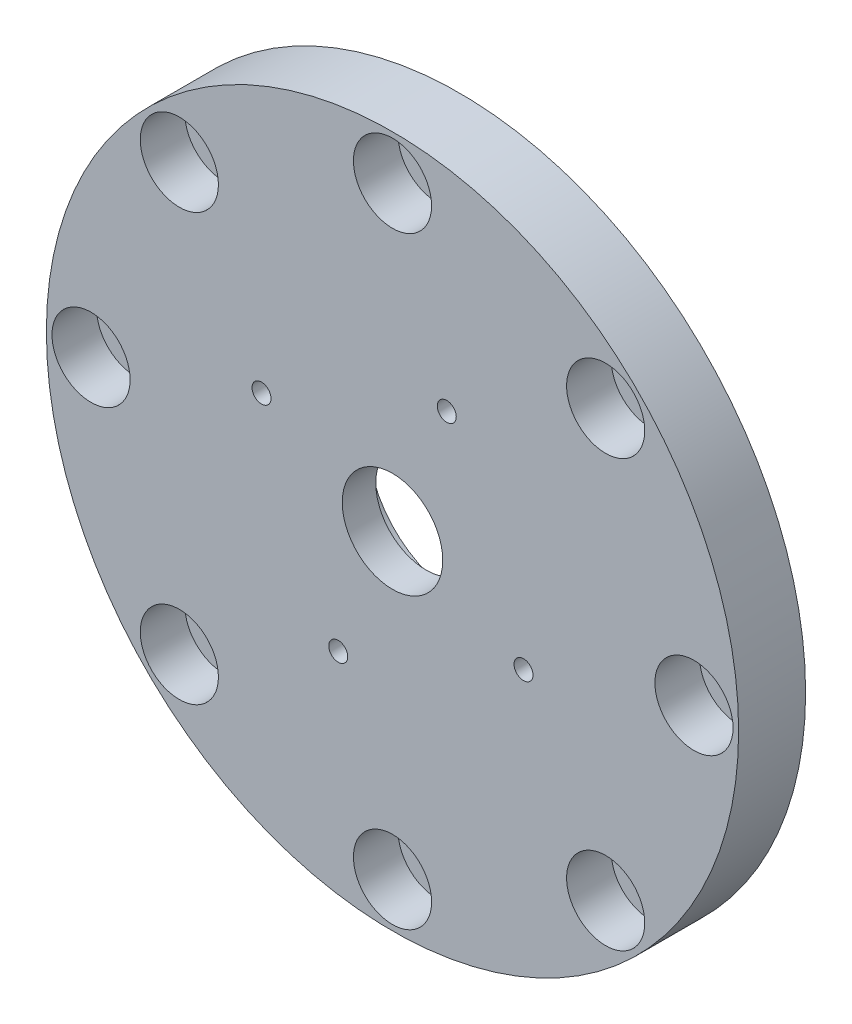
ISO-10303-21;
HEADER;
FILE_DESCRIPTION(('STEP AP214'),'2;1');
FILE_NAME('part.step','',(''),(''),'','','');
FILE_SCHEMA(('AUTOMOTIVE_DESIGN { 1 0 10303 214 1 1 1 1 }'));
ENDSEC;
DATA;
#1=APPLICATION_CONTEXT('core data for automotive mechanical design processes');
#2=APPLICATION_PROTOCOL_DEFINITION('international standard','automotive_design',2000,#1);
#3=PRODUCT_CONTEXT('',#1,'mechanical');
#4=PRODUCT('Part','Part','',(#3));
#5=PRODUCT_RELATED_PRODUCT_CATEGORY('part','',(#4));
#6=PRODUCT_DEFINITION_FORMATION('','',#4);
#7=PRODUCT_DEFINITION_CONTEXT('part definition',#1,'design');
#8=PRODUCT_DEFINITION('design','',#6,#7);
#9=PRODUCT_DEFINITION_SHAPE('','',#8);
#10=(LENGTH_UNIT() NAMED_UNIT(*) SI_UNIT(.MILLI.,.METRE.));
#11=(NAMED_UNIT(*) PLANE_ANGLE_UNIT() SI_UNIT($,.RADIAN.));
#12=(NAMED_UNIT(*) SI_UNIT($,.STERADIAN.) SOLID_ANGLE_UNIT());
#13=UNCERTAINTY_MEASURE_WITH_UNIT(LENGTH_MEASURE(1.E-05),#10,'distance_accuracy_value','');
#14=(GEOMETRIC_REPRESENTATION_CONTEXT(3) GLOBAL_UNCERTAINTY_ASSIGNED_CONTEXT((#13)) GLOBAL_UNIT_ASSIGNED_CONTEXT((#10,
#11,#12)) REPRESENTATION_CONTEXT('',''));
#15=CARTESIAN_POINT('',(0.,0.,0.));
#16=DIRECTION('',(0.,0.,1.));
#17=DIRECTION('',(1.,0.,0.));
#18=AXIS2_PLACEMENT_3D('',#15,#16,#17);
#19=CARTESIAN_POINT('',(4.86007959103561,11.733270062893,6.));
#20=DIRECTION('',(0.,0.,-1.));
#21=DIRECTION('',(-1.,0.,0.));
#22=AXIS2_PLACEMENT_3D('',#19,#20,#21);
#23=CYLINDRICAL_SURFACE('',#22,0.850000000000325);
#24=CARTESIAN_POINT('',(4.86007959103561,11.733270062893,6.));
#25=DIRECTION('',(0.,0.,1.));
#26=DIRECTION('',(1.,0.,0.));
#27=AXIS2_PLACEMENT_3D('',#24,#25,#26);
#28=CIRCLE('',#27,0.850000000000325);
#29=CARTESIAN_POINT('',(5.71007959103593,11.733270062893,6.));
#30=VERTEX_POINT('',#29);
#31=EDGE_CURVE('E52',#30,#30,#28,.T.);
#32=ORIENTED_EDGE('',*,*,#31,.T.);
#33=EDGE_LOOP('',(#32));
#34=FACE_BOUND('',#33,.T.);
#35=CARTESIAN_POINT('',(4.86007959103561,11.733270062893,2.));
#36=DIRECTION('',(0.,0.,-1.));
#37=DIRECTION('',(-1.,0.,0.));
#38=AXIS2_PLACEMENT_3D('',#35,#36,#37);
#39=CIRCLE('',#38,0.850000000000325);
#40=CARTESIAN_POINT('',(4.01007959103528,11.733270062893,2.));
#41=VERTEX_POINT('',#40);
#42=EDGE_CURVE('E41',#41,#41,#39,.T.);
#43=ORIENTED_EDGE('',*,*,#42,.T.);
#44=EDGE_LOOP('',(#43));
#45=FACE_BOUND('',#44,.T.);
#46=ADVANCED_FACE('F37',(#34,#45),#23,.F.);
#47=CARTESIAN_POINT('',(11.7332700628928,-4.86007959103533,6.));
#48=DIRECTION('',(0.,0.,-1.));
#49=DIRECTION('',(-1.,0.,0.));
#50=AXIS2_PLACEMENT_3D('',#47,#48,#49);
#51=CYLINDRICAL_SURFACE('',#50,0.850000000000424);
#52=CARTESIAN_POINT('',(11.7332700628928,-4.86007959103533,6.));
#53=DIRECTION('',(0.,0.,1.));
#54=DIRECTION('',(1.,0.,0.));
#55=AXIS2_PLACEMENT_3D('',#52,#53,#54);
#56=CIRCLE('',#55,0.850000000000424);
#57=CARTESIAN_POINT('',(12.5832700628932,-4.86007959103533,6.));
#58=VERTEX_POINT('',#57);
#59=EDGE_CURVE('E156',#58,#58,#56,.T.);
#60=ORIENTED_EDGE('',*,*,#59,.T.);
#61=EDGE_LOOP('',(#60));
#62=FACE_BOUND('',#61,.T.);
#63=CARTESIAN_POINT('',(11.7332700628928,-4.86007959103533,2.));
#64=DIRECTION('',(0.,0.,-1.));
#65=DIRECTION('',(-1.,0.,0.));
#66=AXIS2_PLACEMENT_3D('',#63,#64,#65);
#67=CIRCLE('',#66,0.850000000000424);
#68=CARTESIAN_POINT('',(10.8832700628924,-4.86007959103533,2.));
#69=VERTEX_POINT('',#68);
#70=EDGE_CURVE('E105',#69,#69,#67,.T.);
#71=ORIENTED_EDGE('',*,*,#70,.T.);
#72=EDGE_LOOP('',(#71));
#73=FACE_BOUND('',#72,.T.);
#74=ADVANCED_FACE('F305',(#62,#73),#51,.F.);
#75=CARTESIAN_POINT('',(-4.86007959103548,-11.7332700628925,6.));
#76=DIRECTION('',(0.,0.,-1.));
#77=DIRECTION('',(-1.,0.,0.));
#78=AXIS2_PLACEMENT_3D('',#75,#76,#77);
#79=CYLINDRICAL_SURFACE('',#78,0.849999999999334);
#80=CARTESIAN_POINT('',(-4.86007959103548,-11.7332700628925,6.));
#81=DIRECTION('',(0.,0.,1.));
#82=DIRECTION('',(1.,0.,0.));
#83=AXIS2_PLACEMENT_3D('',#80,#81,#82);
#84=CIRCLE('',#83,0.849999999999334);
#85=CARTESIAN_POINT('',(-4.01007959103614,-11.7332700628925,6.));
#86=VERTEX_POINT('',#85);
#87=EDGE_CURVE('E152',#86,#86,#84,.T.);
#88=ORIENTED_EDGE('',*,*,#87,.T.);
#89=EDGE_LOOP('',(#88));
#90=FACE_BOUND('',#89,.T.);
#91=CARTESIAN_POINT('',(-4.86007959103548,-11.7332700628925,2.));
#92=DIRECTION('',(0.,0.,-1.));
#93=DIRECTION('',(-1.,0.,0.));
#94=AXIS2_PLACEMENT_3D('',#91,#92,#93);
#95=CIRCLE('',#94,0.849999999999334);
#96=CARTESIAN_POINT('',(-5.71007959103481,-11.7332700628925,2.));
#97=VERTEX_POINT('',#96);
#98=EDGE_CURVE('E101',#97,#97,#95,.T.);
#99=ORIENTED_EDGE('',*,*,#98,.T.);
#100=EDGE_LOOP('',(#99));
#101=FACE_BOUND('',#100,.T.);
#102=ADVANCED_FACE('F200',(#90,#101),#79,.F.);
#103=CARTESIAN_POINT('',(-11.7332700628927,4.86007959103575,6.));
#104=DIRECTION('',(0.,0.,-1.));
#105=DIRECTION('',(-1.,0.,0.));
#106=AXIS2_PLACEMENT_3D('',#103,#104,#105);
#107=CYLINDRICAL_SURFACE('',#106,0.849999999999253);
#108=CARTESIAN_POINT('',(-11.7332700628927,4.86007959103575,6.));
#109=DIRECTION('',(0.,0.,1.));
#110=DIRECTION('',(1.,0.,0.));
#111=AXIS2_PLACEMENT_3D('',#108,#109,#110);
#112=CIRCLE('',#111,0.849999999999253);
#113=CARTESIAN_POINT('',(-10.8832700628934,4.86007959103575,6.));
#114=VERTEX_POINT('',#113);
#115=EDGE_CURVE('E148',#114,#114,#112,.T.);
#116=ORIENTED_EDGE('',*,*,#115,.T.);
#117=EDGE_LOOP('',(#116));
#118=FACE_BOUND('',#117,.T.);
#119=CARTESIAN_POINT('',(-11.7332700628927,4.86007959103575,2.));
#120=DIRECTION('',(0.,0.,-1.));
#121=DIRECTION('',(-1.,0.,0.));
#122=AXIS2_PLACEMENT_3D('',#119,#120,#121);
#123=CIRCLE('',#122,0.849999999999253);
#124=CARTESIAN_POINT('',(-12.5832700628919,4.86007959103575,2.));
#125=VERTEX_POINT('',#124);
#126=EDGE_CURVE('E97',#125,#125,#123,.T.);
#127=ORIENTED_EDGE('',*,*,#126,.T.);
#128=EDGE_LOOP('',(#127));
#129=FACE_BOUND('',#128,.T.);
#130=ADVANCED_FACE('F196',(#118,#129),#107,.F.);
#131=CARTESIAN_POINT('',(-27.,0.,6.));
#132=DIRECTION('',(0.,0.,-1.));
#133=DIRECTION('',(-1.,0.,0.));
#134=AXIS2_PLACEMENT_3D('',#131,#132,#133);
#135=CYLINDRICAL_SURFACE('',#134,1.55);
#136=CARTESIAN_POINT('',(-27.,0.,0.));
#137=DIRECTION('',(0.,0.,1.));
#138=DIRECTION('',(1.,0.,0.));
#139=AXIS2_PLACEMENT_3D('',#136,#137,#138);
#140=CIRCLE('',#139,1.55);
#141=CARTESIAN_POINT('',(-25.45,0.,0.));
#142=VERTEX_POINT('',#141);
#143=EDGE_CURVE('E172',#142,#142,#140,.T.);
#144=ORIENTED_EDGE('',*,*,#143,.F.);
#145=EDGE_LOOP('',(#144));
#146=FACE_BOUND('',#145,.T.);
#147=CARTESIAN_POINT('',(-27.,0.,2.));
#148=DIRECTION('',(0.,0.,1.));
#149=DIRECTION('',(1.,0.,0.));
#150=AXIS2_PLACEMENT_3D('',#147,#148,#149);
#151=CIRCLE('',#150,1.55);
#152=CARTESIAN_POINT('',(-25.45,0.,2.));
#153=VERTEX_POINT('',#152);
#154=EDGE_CURVE('E92',#153,#153,#151,.T.);
#155=ORIENTED_EDGE('',*,*,#154,.T.);
#156=EDGE_LOOP('',(#155));
#157=FACE_BOUND('',#156,.T.);
#158=ADVANCED_FACE('F199',(#146,#157),#135,.F.);
#159=CARTESIAN_POINT('',(-19.0918830920367,19.0918830920368,6.));
#160=DIRECTION('',(0.,0.,-1.));
#161=DIRECTION('',(-1.,0.,0.));
#162=AXIS2_PLACEMENT_3D('',#159,#160,#161);
#163=CYLINDRICAL_SURFACE('',#162,1.54999999999999);
#164=CARTESIAN_POINT('',(-19.0918830920367,19.0918830920368,0.));
#165=DIRECTION('',(0.,0.,1.));
#166=DIRECTION('',(1.,0.,0.));
#167=AXIS2_PLACEMENT_3D('',#164,#165,#166);
#168=CIRCLE('',#167,1.54999999999999);
#169=CARTESIAN_POINT('',(-17.5418830920368,19.0918830920368,0.));
#170=VERTEX_POINT('',#169);
#171=EDGE_CURVE('E168',#170,#170,#168,.T.);
#172=ORIENTED_EDGE('',*,*,#171,.F.);
#173=EDGE_LOOP('',(#172));
#174=FACE_BOUND('',#173,.T.);
#175=CARTESIAN_POINT('',(-19.0918830920367,19.0918830920368,2.));
#176=DIRECTION('',(0.,0.,1.));
#177=DIRECTION('',(1.,0.,0.));
#178=AXIS2_PLACEMENT_3D('',#175,#176,#177);
#179=CIRCLE('',#178,1.54999999999999);
#180=CARTESIAN_POINT('',(-17.5418830920368,19.0918830920368,2.));
#181=VERTEX_POINT('',#180);
#182=EDGE_CURVE('E88',#181,#181,#179,.T.);
#183=ORIENTED_EDGE('',*,*,#182,.T.);
#184=EDGE_LOOP('',(#183));
#185=FACE_BOUND('',#184,.T.);
#186=ADVANCED_FACE('F386',(#174,#185),#163,.F.);
#187=CARTESIAN_POINT('',(0.,27.,6.));
#188=DIRECTION('',(0.,0.,-1.));
#189=DIRECTION('',(-1.,0.,0.));
#190=AXIS2_PLACEMENT_3D('',#187,#188,#189);
#191=CYLINDRICAL_SURFACE('',#190,1.55);
#192=CARTESIAN_POINT('',(0.,27.,0.));
#193=DIRECTION('',(0.,0.,1.));
#194=DIRECTION('',(1.,0.,0.));
#195=AXIS2_PLACEMENT_3D('',#192,#193,#194);
#196=CIRCLE('',#195,1.55);
#197=CARTESIAN_POINT('',(1.55000000000009,27.,0.));
#198=VERTEX_POINT('',#197);
#199=EDGE_CURVE('E164',#198,#198,#196,.T.);
#200=ORIENTED_EDGE('',*,*,#199,.F.);
#201=EDGE_LOOP('',(#200));
#202=FACE_BOUND('',#201,.T.);
#203=CARTESIAN_POINT('',(0.,27.,2.));
#204=DIRECTION('',(0.,0.,1.));
#205=DIRECTION('',(1.,0.,0.));
#206=AXIS2_PLACEMENT_3D('',#203,#204,#205);
#207=CIRCLE('',#206,1.55);
#208=CARTESIAN_POINT('',(1.55000000000009,27.,2.));
#209=VERTEX_POINT('',#208);
#210=EDGE_CURVE('E84',#209,#209,#207,.T.);
#211=ORIENTED_EDGE('',*,*,#210,.T.);
#212=EDGE_LOOP('',(#211));
#213=FACE_BOUND('',#212,.T.);
#214=ADVANCED_FACE('F390',(#202,#213),#191,.F.);
#215=CARTESIAN_POINT('',(19.0918830920369,19.0918830920367,6.));
#216=DIRECTION('',(0.,0.,-1.));
#217=DIRECTION('',(-1.,0.,0.));
#218=AXIS2_PLACEMENT_3D('',#215,#216,#217);
#219=CYLINDRICAL_SURFACE('',#218,1.55);
#220=CARTESIAN_POINT('',(19.0918830920369,19.0918830920367,0.));
#221=DIRECTION('',(0.,0.,1.));
#222=DIRECTION('',(1.,0.,0.));
#223=AXIS2_PLACEMENT_3D('',#220,#221,#222);
#224=CIRCLE('',#223,1.55);
#225=CARTESIAN_POINT('',(20.6418830920369,19.0918830920367,0.));
#226=VERTEX_POINT('',#225);
#227=EDGE_CURVE('E160',#226,#226,#224,.T.);
#228=ORIENTED_EDGE('',*,*,#227,.F.);
#229=EDGE_LOOP('',(#228));
#230=FACE_BOUND('',#229,.T.);
#231=CARTESIAN_POINT('',(19.0918830920369,19.0918830920367,2.));
#232=DIRECTION('',(0.,0.,1.));
#233=DIRECTION('',(1.,0.,0.));
#234=AXIS2_PLACEMENT_3D('',#231,#232,#233);
#235=CIRCLE('',#234,1.55);
#236=CARTESIAN_POINT('',(20.6418830920369,19.0918830920367,2.));
#237=VERTEX_POINT('',#236);
#238=EDGE_CURVE('E80',#237,#237,#235,.T.);
#239=ORIENTED_EDGE('',*,*,#238,.T.);
#240=EDGE_LOOP('',(#239));
#241=FACE_BOUND('',#240,.T.);
#242=ADVANCED_FACE('F394',(#230,#241),#219,.F.);
#243=CARTESIAN_POINT('',(27.,-1.85233445939831E-13,6.));
#244=DIRECTION('',(0.,0.,-1.));
#245=DIRECTION('',(-1.,0.,0.));
#246=AXIS2_PLACEMENT_3D('',#243,#244,#245);
#247=CYLINDRICAL_SURFACE('',#246,1.55);
#248=CARTESIAN_POINT('',(27.,-1.85233445939831E-13,0.));
#249=DIRECTION('',(0.,0.,1.));
#250=DIRECTION('',(1.,0.,0.));
#251=AXIS2_PLACEMENT_3D('',#248,#249,#250);
#252=CIRCLE('',#251,1.55);
#253=CARTESIAN_POINT('',(28.55,-1.85233445939831E-13,0.));
#254=VERTEX_POINT('',#253);
#255=EDGE_CURVE('E144',#254,#254,#252,.T.);
#256=ORIENTED_EDGE('',*,*,#255,.F.);
#257=EDGE_LOOP('',(#256));
#258=FACE_BOUND('',#257,.T.);
#259=CARTESIAN_POINT('',(27.,-1.85233445939831E-13,2.));
#260=DIRECTION('',(0.,0.,1.));
#261=DIRECTION('',(1.,0.,0.));
#262=AXIS2_PLACEMENT_3D('',#259,#260,#261);
#263=CIRCLE('',#262,1.55);
#264=CARTESIAN_POINT('',(28.55,-1.85233445939831E-13,2.));
#265=VERTEX_POINT('',#264);
#266=EDGE_CURVE('E76',#265,#265,#263,.T.);
#267=ORIENTED_EDGE('',*,*,#266,.T.);
#268=EDGE_LOOP('',(#267));
#269=FACE_BOUND('',#268,.T.);
#270=ADVANCED_FACE('F397',(#258,#269),#247,.F.);
#271=CARTESIAN_POINT('',(19.0918830920366,-19.0918830920369,6.));
#272=DIRECTION('',(0.,0.,-1.));
#273=DIRECTION('',(-1.,0.,0.));
#274=AXIS2_PLACEMENT_3D('',#271,#272,#273);
#275=CYLINDRICAL_SURFACE('',#274,1.55);
#276=CARTESIAN_POINT('',(19.0918830920366,-19.0918830920369,0.));
#277=DIRECTION('',(0.,0.,1.));
#278=DIRECTION('',(1.,0.,0.));
#279=AXIS2_PLACEMENT_3D('',#276,#277,#278);
#280=CIRCLE('',#279,1.55);
#281=CARTESIAN_POINT('',(20.6418830920366,-19.0918830920369,0.));
#282=VERTEX_POINT('',#281);
#283=EDGE_CURVE('E140',#282,#282,#280,.T.);
#284=ORIENTED_EDGE('',*,*,#283,.F.);
#285=EDGE_LOOP('',(#284));
#286=FACE_BOUND('',#285,.T.);
#287=CARTESIAN_POINT('',(19.0918830920366,-19.0918830920369,2.));
#288=DIRECTION('',(0.,0.,1.));
#289=DIRECTION('',(1.,0.,0.));
#290=AXIS2_PLACEMENT_3D('',#287,#288,#289);
#291=CIRCLE('',#290,1.55);
#292=CARTESIAN_POINT('',(20.6418830920366,-19.0918830920369,2.));
#293=VERTEX_POINT('',#292);
#294=EDGE_CURVE('E72',#293,#293,#291,.T.);
#295=ORIENTED_EDGE('',*,*,#294,.T.);
#296=EDGE_LOOP('',(#295));
#297=FACE_BOUND('',#296,.T.);
#298=ADVANCED_FACE('F402',(#286,#297),#275,.F.);
#299=CARTESIAN_POINT('',(-2.79503442088596E-13,-27.,6.));
#300=DIRECTION('',(0.,0.,-1.));
#301=DIRECTION('',(-1.,0.,0.));
#302=AXIS2_PLACEMENT_3D('',#299,#300,#301);
#303=CYLINDRICAL_SURFACE('',#302,1.55);
#304=CARTESIAN_POINT('',(-2.79503442088596E-13,-27.,0.));
#305=DIRECTION('',(0.,0.,1.));
#306=DIRECTION('',(1.,0.,0.));
#307=AXIS2_PLACEMENT_3D('',#304,#305,#306);
#308=CIRCLE('',#307,1.55);
#309=CARTESIAN_POINT('',(1.54999999999972,-27.,0.));
#310=VERTEX_POINT('',#309);
#311=EDGE_CURVE('E136',#310,#310,#308,.T.);
#312=ORIENTED_EDGE('',*,*,#311,.F.);
#313=EDGE_LOOP('',(#312));
#314=FACE_BOUND('',#313,.T.);
#315=CARTESIAN_POINT('',(-2.79503442088596E-13,-27.,2.));
#316=DIRECTION('',(0.,0.,1.));
#317=DIRECTION('',(1.,0.,0.));
#318=AXIS2_PLACEMENT_3D('',#315,#316,#317);
#319=CIRCLE('',#318,1.55);
#320=CARTESIAN_POINT('',(1.54999999999972,-27.,2.));
#321=VERTEX_POINT('',#320);
#322=EDGE_CURVE('E67',#321,#321,#319,.T.);
#323=ORIENTED_EDGE('',*,*,#322,.T.);
#324=EDGE_LOOP('',(#323));
#325=FACE_BOUND('',#324,.T.);
#326=ADVANCED_FACE('F349',(#314,#325),#303,.F.);
#327=CARTESIAN_POINT('',(-19.091883092037,-19.0918830920366,6.));
#328=DIRECTION('',(0.,0.,-1.));
#329=DIRECTION('',(-1.,0.,0.));
#330=AXIS2_PLACEMENT_3D('',#327,#328,#329);
#331=CYLINDRICAL_SURFACE('',#330,1.55);
#332=CARTESIAN_POINT('',(-19.091883092037,-19.0918830920366,0.));
#333=DIRECTION('',(0.,0.,1.));
#334=DIRECTION('',(1.,0.,0.));
#335=AXIS2_PLACEMENT_3D('',#332,#333,#334);
#336=CIRCLE('',#335,1.55);
#337=CARTESIAN_POINT('',(-17.541883092037,-19.0918830920366,0.));
#338=VERTEX_POINT('',#337);
#339=EDGE_CURVE('E61',#338,#338,#336,.T.);
#340=ORIENTED_EDGE('',*,*,#339,.F.);
#341=EDGE_LOOP('',(#340));
#342=FACE_BOUND('',#341,.T.);
#343=CARTESIAN_POINT('',(-19.091883092037,-19.0918830920366,2.));
#344=DIRECTION('',(0.,0.,1.));
#345=DIRECTION('',(1.,0.,0.));
#346=AXIS2_PLACEMENT_3D('',#343,#344,#345);
#347=CIRCLE('',#346,1.55);
#348=CARTESIAN_POINT('',(-17.541883092037,-19.0918830920366,2.));
#349=VERTEX_POINT('',#348);
#350=EDGE_CURVE('E63',#349,#349,#347,.T.);
#351=ORIENTED_EDGE('',*,*,#350,.T.);
#352=EDGE_LOOP('',(#351));
#353=FACE_BOUND('',#352,.T.);
#354=ADVANCED_FACE('F346',(#342,#353),#331,.F.);
#355=CARTESIAN_POINT('',(0.,0.,6.));
#356=DIRECTION('',(0.,0.,-1.));
#357=DIRECTION('',(-1.,0.,0.));
#358=AXIS2_PLACEMENT_3D('',#355,#356,#357);
#359=CYLINDRICAL_SURFACE('',#358,4.50000000000002);
#360=CARTESIAN_POINT('',(0.,0.,6.));
#361=DIRECTION('',(0.,0.,1.));
#362=DIRECTION('',(1.,0.,0.));
#363=AXIS2_PLACEMENT_3D('',#360,#361,#362);
#364=CIRCLE('',#363,4.50000000000002);
#365=CARTESIAN_POINT('',(4.5,0.,6.));
#366=VERTEX_POINT('',#365);
#367=EDGE_CURVE('E175',#366,#366,#364,.T.);
#368=ORIENTED_EDGE('',*,*,#367,.T.);
#369=EDGE_LOOP('',(#368));
#370=FACE_BOUND('',#369,.T.);
#371=CARTESIAN_POINT('',(0.,0.,3.));
#372=DIRECTION('',(0.,0.,-1.));
#373=DIRECTION('',(-1.,0.,0.));
#374=AXIS2_PLACEMENT_3D('',#371,#372,#373);
#375=CIRCLE('',#374,4.50000000000002);
#376=CARTESIAN_POINT('',(-4.50000000000004,0.,3.));
#377=VERTEX_POINT('',#376);
#378=EDGE_CURVE('E57',#377,#377,#375,.T.);
#379=ORIENTED_EDGE('',*,*,#378,.T.);
#380=EDGE_LOOP('',(#379));
#381=FACE_BOUND('',#380,.T.);
#382=ADVANCED_FACE('F189',(#370,#381),#359,.F.);
#383=CARTESIAN_POINT('',(0.,0.,6.));
#384=DIRECTION('',(0.,0.,1.));
#385=DIRECTION('',(1.,0.,0.));
#386=AXIS2_PLACEMENT_3D('',#383,#384,#385);
#387=PLANE('',#386);
#388=CARTESIAN_POINT('',(0.,27.,6.));
#389=DIRECTION('',(0.,0.,1.));
#390=DIRECTION('',(1.,0.,0.));
#391=AXIS2_PLACEMENT_3D('',#388,#389,#390);
#392=CIRCLE('',#391,3.5);
#393=CARTESIAN_POINT('',(3.50000000000009,27.,6.));
#394=VERTEX_POINT('',#393);
#395=EDGE_CURVE('E245',#394,#394,#392,.T.);
#396=ORIENTED_EDGE('',*,*,#395,.F.);
#397=EDGE_LOOP('',(#396));
#398=FACE_BOUND('',#397,.T.);
#399=CARTESIAN_POINT('',(19.0918830920372,19.0918830920375,6.));
#400=DIRECTION('',(0.,0.,1.));
#401=DIRECTION('',(1.,0.,0.));
#402=AXIS2_PLACEMENT_3D('',#399,#400,#401);
#403=CIRCLE('',#402,3.50000000000013);
#404=CARTESIAN_POINT('',(22.5918830920373,19.0918830920375,6.));
#405=VERTEX_POINT('',#404);
#406=EDGE_CURVE('E253',#405,#405,#403,.T.);
#407=ORIENTED_EDGE('',*,*,#406,.F.);
#408=EDGE_LOOP('',(#407));
#409=FACE_BOUND('',#408,.T.);
#410=CARTESIAN_POINT('',(27.0000000000011,1.05184941624605E-12,6.));
#411=DIRECTION('',(0.,0.,1.));
#412=DIRECTION('',(1.,0.,0.));
#413=AXIS2_PLACEMENT_3D('',#410,#411,#412);
#414=CIRCLE('',#413,3.50000000000085);
#415=CARTESIAN_POINT('',(30.500000000002,1.05184941624605E-12,6.));
#416=VERTEX_POINT('',#415);
#417=EDGE_CURVE('E261',#416,#416,#414,.T.);
#418=ORIENTED_EDGE('',*,*,#417,.F.);
#419=EDGE_LOOP('',(#418));
#420=FACE_BOUND('',#419,.T.);
#421=CARTESIAN_POINT('',(19.0918830920387,-19.091883092036,6.));
#422=DIRECTION('',(0.,0.,1.));
#423=DIRECTION('',(1.,0.,0.));
#424=AXIS2_PLACEMENT_3D('',#421,#422,#423);
#425=CIRCLE('',#424,3.50000000000177);
#426=CARTESIAN_POINT('',(22.5918830920404,-19.091883092036,6.));
#427=VERTEX_POINT('',#426);
#428=EDGE_CURVE('E269',#427,#427,#425,.T.);
#429=ORIENTED_EDGE('',*,*,#428,.F.);
#430=EDGE_LOOP('',(#429));
#431=FACE_BOUND('',#430,.T.);
#432=CARTESIAN_POINT('',(2.19466228228317E-12,-27.,6.));
#433=DIRECTION('',(0.,0.,1.));
#434=DIRECTION('',(1.,0.,0.));
#435=AXIS2_PLACEMENT_3D('',#432,#433,#434);
#436=CIRCLE('',#435,3.50000000000237);
#437=CARTESIAN_POINT('',(3.50000000000456,-27.,6.));
#438=VERTEX_POINT('',#437);
#439=EDGE_CURVE('E277',#438,#438,#436,.T.);
#440=ORIENTED_EDGE('',*,*,#439,.F.);
#441=EDGE_LOOP('',(#440));
#442=FACE_BOUND('',#441,.T.);
#443=CARTESIAN_POINT('',(-19.0918830920349,-19.0918830920375,6.));
#444=DIRECTION('',(0.,0.,1.));
#445=DIRECTION('',(1.,0.,0.));
#446=AXIS2_PLACEMENT_3D('',#443,#444,#445);
#447=CIRCLE('',#446,3.50000000000232);
#448=CARTESIAN_POINT('',(-15.5918830920326,-19.0918830920375,6.));
#449=VERTEX_POINT('',#448);
#450=EDGE_CURVE('E285',#449,#449,#447,.T.);
#451=ORIENTED_EDGE('',*,*,#450,.F.);
#452=EDGE_LOOP('',(#451));
#453=FACE_BOUND('',#452,.T.);
#454=CARTESIAN_POINT('',(-26.9999999999989,-1.05515596260375E-12,6.));
#455=DIRECTION('',(0.,0.,1.));
#456=DIRECTION('',(1.,0.,0.));
#457=AXIS2_PLACEMENT_3D('',#454,#455,#456);
#458=CIRCLE('',#457,3.5000000000017);
#459=CARTESIAN_POINT('',(-23.4999999999972,-1.05515596260375E-12,6.));
#460=VERTEX_POINT('',#459);
#461=EDGE_CURVE('E123',#460,#460,#458,.T.);
#462=ORIENTED_EDGE('',*,*,#461,.F.);
#463=EDGE_LOOP('',(#462));
#464=FACE_BOUND('',#463,.T.);
#465=CARTESIAN_POINT('',(-19.0918830920364,19.091883092036,6.));
#466=DIRECTION('',(0.,0.,1.));
#467=DIRECTION('',(1.,0.,0.));
#468=AXIS2_PLACEMENT_3D('',#465,#466,#467);
#469=CIRCLE('',#468,3.50000000000088);
#470=CARTESIAN_POINT('',(-15.5918830920355,19.091883092036,6.));
#471=VERTEX_POINT('',#470);
#472=EDGE_CURVE('E112',#471,#471,#469,.T.);
#473=ORIENTED_EDGE('',*,*,#472,.F.);
#474=EDGE_LOOP('',(#473));
#475=FACE_BOUND('',#474,.T.);
#476=ORIENTED_EDGE('',*,*,#87,.F.);
#477=EDGE_LOOP('',(#476));
#478=FACE_BOUND('',#477,.T.);
#479=ORIENTED_EDGE('',*,*,#367,.F.);
#480=EDGE_LOOP('',(#479));
#481=FACE_BOUND('',#480,.T.);
#482=CARTESIAN_POINT('',(0.,0.,6.));
#483=DIRECTION('',(0.,0.,1.));
#484=DIRECTION('',(1.,0.,0.));
#485=AXIS2_PLACEMENT_3D('',#482,#483,#484);
#486=CIRCLE('',#485,31.);
#487=CARTESIAN_POINT('',(31.,0.,6.));
#488=VERTEX_POINT('',#487);
#489=EDGE_CURVE('E10',#488,#488,#486,.T.);
#490=ORIENTED_EDGE('',*,*,#489,.T.);
#491=EDGE_LOOP('',(#490));
#492=FACE_BOUND('',#491,.T.);
#493=ORIENTED_EDGE('',*,*,#31,.F.);
#494=EDGE_LOOP('',(#493));
#495=FACE_BOUND('',#494,.T.);
#496=ORIENTED_EDGE('',*,*,#59,.F.);
#497=EDGE_LOOP('',(#496));
#498=FACE_BOUND('',#497,.T.);
#499=ORIENTED_EDGE('',*,*,#115,.F.);
#500=EDGE_LOOP('',(#499));
#501=FACE_BOUND('',#500,.T.);
#502=ADVANCED_FACE('F185',(#398,#409,#420,#431,#442,#453,#464,#475,#478,#481,#492,#495,#498,
#501),#387,.T.);
#503=CARTESIAN_POINT('',(0.,0.,0.));
#504=DIRECTION('',(0.,0.,1.));
#505=DIRECTION('',(1.,0.,0.));
#506=AXIS2_PLACEMENT_3D('',#503,#504,#505);
#507=PLANE('',#506);
#508=CARTESIAN_POINT('',(4.86007959103561,11.733270062893,0.));
#509=DIRECTION('',(0.,0.,-1.));
#510=DIRECTION('',(-1.,0.,0.));
#511=AXIS2_PLACEMENT_3D('',#508,#509,#510);
#512=CIRCLE('',#511,2.2);
#513=CARTESIAN_POINT('',(2.66007959103561,11.733270062893,0.));
#514=VERTEX_POINT('',#513);
#515=EDGE_CURVE('E215',#514,#514,#512,.T.);
#516=ORIENTED_EDGE('',*,*,#515,.F.);
#517=EDGE_LOOP('',(#516));
#518=FACE_BOUND('',#517,.T.);
#519=CARTESIAN_POINT('',(-11.7332700628929,4.86007959103561,0.));
#520=DIRECTION('',(0.,0.,-1.));
#521=DIRECTION('',(-1.,0.,0.));
#522=AXIS2_PLACEMENT_3D('',#519,#520,#521);
#523=CIRCLE('',#522,2.2);
#524=CARTESIAN_POINT('',(-13.9332700628929,4.86007959103561,0.));
#525=VERTEX_POINT('',#524);
#526=EDGE_CURVE('E216',#525,#525,#523,.T.);
#527=ORIENTED_EDGE('',*,*,#526,.F.);
#528=EDGE_LOOP('',(#527));
#529=FACE_BOUND('',#528,.T.);
#530=CARTESIAN_POINT('',(-4.86007959103561,-11.733270062893,0.));
#531=DIRECTION('',(0.,0.,-1.));
#532=DIRECTION('',(-1.,0.,0.));
#533=AXIS2_PLACEMENT_3D('',#530,#531,#532);
#534=CIRCLE('',#533,2.2);
#535=CARTESIAN_POINT('',(-7.06007959103561,-11.733270062893,0.));
#536=VERTEX_POINT('',#535);
#537=EDGE_CURVE('E230',#536,#536,#534,.T.);
#538=ORIENTED_EDGE('',*,*,#537,.F.);
#539=EDGE_LOOP('',(#538));
#540=FACE_BOUND('',#539,.T.);
#541=CARTESIAN_POINT('',(11.7332700628929,-4.86007959103561,0.));
#542=DIRECTION('',(0.,0.,-1.));
#543=DIRECTION('',(-1.,0.,0.));
#544=AXIS2_PLACEMENT_3D('',#541,#542,#543);
#545=CIRCLE('',#544,2.2);
#546=CARTESIAN_POINT('',(9.53327006289295,-4.86007959103561,0.));
#547=VERTEX_POINT('',#546);
#548=EDGE_CURVE('E238',#547,#547,#545,.T.);
#549=ORIENTED_EDGE('',*,*,#548,.F.);
#550=EDGE_LOOP('',(#549));
#551=FACE_BOUND('',#550,.T.);
#552=CARTESIAN_POINT('',(0.,0.,0.));
#553=DIRECTION('',(0.,0.,-1.));
#554=DIRECTION('',(-1.,0.,0.));
#555=AXIS2_PLACEMENT_3D('',#552,#553,#554);
#556=CIRCLE('',#555,8.2);
#557=CARTESIAN_POINT('',(-8.2,0.,0.));
#558=VERTEX_POINT('',#557);
#559=EDGE_CURVE('E96',#558,#558,#556,.T.);
#560=ORIENTED_EDGE('',*,*,#559,.F.);
#561=EDGE_LOOP('',(#560));
#562=FACE_BOUND('',#561,.T.);
#563=CARTESIAN_POINT('',(0.,0.,0.));
#564=DIRECTION('',(0.,0.,1.));
#565=DIRECTION('',(1.,0.,0.));
#566=AXIS2_PLACEMENT_3D('',#563,#564,#565);
#567=CIRCLE('',#566,31.);
#568=CARTESIAN_POINT('',(31.,0.,0.));
#569=VERTEX_POINT('',#568);
#570=EDGE_CURVE('E46',#569,#569,#567,.T.);
#571=ORIENTED_EDGE('',*,*,#570,.F.);
#572=EDGE_LOOP('',(#571));
#573=FACE_BOUND('',#572,.T.);
#574=ORIENTED_EDGE('',*,*,#143,.T.);
#575=EDGE_LOOP('',(#574));
#576=FACE_BOUND('',#575,.T.);
#577=ORIENTED_EDGE('',*,*,#171,.T.);
#578=EDGE_LOOP('',(#577));
#579=FACE_BOUND('',#578,.T.);
#580=ORIENTED_EDGE('',*,*,#199,.T.);
#581=EDGE_LOOP('',(#580));
#582=FACE_BOUND('',#581,.T.);
#583=ORIENTED_EDGE('',*,*,#227,.T.);
#584=EDGE_LOOP('',(#583));
#585=FACE_BOUND('',#584,.T.);
#586=ORIENTED_EDGE('',*,*,#255,.T.);
#587=EDGE_LOOP('',(#586));
#588=FACE_BOUND('',#587,.T.);
#589=ORIENTED_EDGE('',*,*,#283,.T.);
#590=EDGE_LOOP('',(#589));
#591=FACE_BOUND('',#590,.T.);
#592=ORIENTED_EDGE('',*,*,#311,.T.);
#593=EDGE_LOOP('',(#592));
#594=FACE_BOUND('',#593,.T.);
#595=ORIENTED_EDGE('',*,*,#339,.T.);
#596=EDGE_LOOP('',(#595));
#597=FACE_BOUND('',#596,.T.);
#598=ADVANCED_FACE('F188',(#518,#529,#540,#551,#562,#573,#576,#579,#582,#585,#588,#591,#594,
#597),#507,.F.);
#599=CARTESIAN_POINT('',(0.,0.,6.));
#600=DIRECTION('',(0.,0.,-1.));
#601=DIRECTION('',(-1.,0.,0.));
#602=AXIS2_PLACEMENT_3D('',#599,#600,#601);
#603=CYLINDRICAL_SURFACE('',#602,31.);
#604=ORIENTED_EDGE('',*,*,#489,.F.);
#605=EDGE_LOOP('',(#604));
#606=FACE_BOUND('',#605,.T.);
#607=ORIENTED_EDGE('',*,*,#570,.T.);
#608=EDGE_LOOP('',(#607));
#609=FACE_BOUND('',#608,.T.);
#610=ADVANCED_FACE('F39',(#606,#609),#603,.T.);
#611=CARTESIAN_POINT('',(0.,0.,3.));
#612=DIRECTION('',(0.,0.,-1.));
#613=DIRECTION('',(-1.,0.,0.));
#614=AXIS2_PLACEMENT_3D('',#611,#612,#613);
#615=CYLINDRICAL_SURFACE('',#614,8.2);
#616=CARTESIAN_POINT('',(0.,0.,3.));
#617=DIRECTION('',(0.,0.,-1.));
#618=DIRECTION('',(-1.,0.,0.));
#619=AXIS2_PLACEMENT_3D('',#616,#617,#618);
#620=CIRCLE('',#619,8.2);
#621=CARTESIAN_POINT('',(-8.2,0.,3.));
#622=VERTEX_POINT('',#621);
#623=EDGE_CURVE('E62',#622,#622,#620,.T.);
#624=ORIENTED_EDGE('',*,*,#623,.F.);
#625=EDGE_LOOP('',(#624));
#626=FACE_BOUND('',#625,.T.);
#627=ORIENTED_EDGE('',*,*,#559,.T.);
#628=EDGE_LOOP('',(#627));
#629=FACE_BOUND('',#628,.T.);
#630=ADVANCED_FACE('F370',(#626,#629),#615,.F.);
#631=CARTESIAN_POINT('',(0.,0.,3.));
#632=DIRECTION('',(0.,0.,-1.));
#633=DIRECTION('',(-1.,0.,0.));
#634=AXIS2_PLACEMENT_3D('',#631,#632,#633);
#635=PLANE('',#634);
#636=ORIENTED_EDGE('',*,*,#378,.F.);
#637=EDGE_LOOP('',(#636));
#638=FACE_BOUND('',#637,.T.);
#639=ORIENTED_EDGE('',*,*,#623,.T.);
#640=EDGE_LOOP('',(#639));
#641=FACE_BOUND('',#640,.T.);
#642=ADVANCED_FACE('F363',(#638,#641),#635,.T.);
#643=CARTESIAN_POINT('',(-19.0918830920349,-19.0918830920375,2.));
#644=DIRECTION('',(0.,0.,1.));
#645=DIRECTION('',(1.,0.,0.));
#646=AXIS2_PLACEMENT_3D('',#643,#644,#645);
#647=CYLINDRICAL_SURFACE('',#646,3.50000000000232);
#648=CARTESIAN_POINT('',(-19.0918830920349,-19.0918830920375,2.));
#649=DIRECTION('',(0.,0.,1.));
#650=DIRECTION('',(1.,0.,0.));
#651=AXIS2_PLACEMENT_3D('',#648,#649,#650);
#652=CIRCLE('',#651,3.50000000000232);
#653=CARTESIAN_POINT('',(-15.5918830920326,-19.0918830920375,2.));
#654=VERTEX_POINT('',#653);
#655=EDGE_CURVE('E281',#654,#654,#652,.T.);
#656=ORIENTED_EDGE('',*,*,#655,.F.);
#657=EDGE_LOOP('',(#656));
#658=FACE_BOUND('',#657,.T.);
#659=ORIENTED_EDGE('',*,*,#450,.T.);
#660=EDGE_LOOP('',(#659));
#661=FACE_BOUND('',#660,.T.);
#662=ADVANCED_FACE('F357',(#658,#661),#647,.F.);
#663=CARTESIAN_POINT('',(-19.0918830920349,-19.0918830920375,2.));
#664=DIRECTION('',(0.,0.,1.));
#665=DIRECTION('',(1.,0.,0.));
#666=AXIS2_PLACEMENT_3D('',#663,#664,#665);
#667=PLANE('',#666);
#668=ORIENTED_EDGE('',*,*,#350,.F.);
#669=EDGE_LOOP('',(#668));
#670=FACE_BOUND('',#669,.T.);
#671=ORIENTED_EDGE('',*,*,#655,.T.);
#672=EDGE_LOOP('',(#671));
#673=FACE_BOUND('',#672,.T.);
#674=ADVANCED_FACE('F353',(#670,#673),#667,.T.);
#675=CARTESIAN_POINT('',(2.19466228228317E-12,-27.,2.));
#676=DIRECTION('',(0.,0.,1.));
#677=DIRECTION('',(1.,0.,0.));
#678=AXIS2_PLACEMENT_3D('',#675,#676,#677);
#679=CYLINDRICAL_SURFACE('',#678,3.50000000000237);
#680=CARTESIAN_POINT('',(2.19466228228317E-12,-27.,2.));
#681=DIRECTION('',(0.,0.,1.));
#682=DIRECTION('',(1.,0.,0.));
#683=AXIS2_PLACEMENT_3D('',#680,#681,#682);
#684=CIRCLE('',#683,3.50000000000237);
#685=CARTESIAN_POINT('',(3.50000000000456,-27.,2.));
#686=VERTEX_POINT('',#685);
#687=EDGE_CURVE('E273',#686,#686,#684,.T.);
#688=ORIENTED_EDGE('',*,*,#687,.F.);
#689=EDGE_LOOP('',(#688));
#690=FACE_BOUND('',#689,.T.);
#691=ORIENTED_EDGE('',*,*,#439,.T.);
#692=EDGE_LOOP('',(#691));
#693=FACE_BOUND('',#692,.T.);
#694=ADVANCED_FACE('F356',(#690,#693),#679,.F.);
#695=CARTESIAN_POINT('',(2.19466228228317E-12,-27.,2.));
#696=DIRECTION('',(0.,0.,1.));
#697=DIRECTION('',(1.,0.,0.));
#698=AXIS2_PLACEMENT_3D('',#695,#696,#697);
#699=PLANE('',#698);
#700=ORIENTED_EDGE('',*,*,#322,.F.);
#701=EDGE_LOOP('',(#700));
#702=FACE_BOUND('',#701,.T.);
#703=ORIENTED_EDGE('',*,*,#687,.T.);
#704=EDGE_LOOP('',(#703));
#705=FACE_BOUND('',#704,.T.);
#706=ADVANCED_FACE('F478',(#702,#705),#699,.T.);
#707=CARTESIAN_POINT('',(19.0918830920387,-19.091883092036,2.));
#708=DIRECTION('',(0.,0.,1.));
#709=DIRECTION('',(1.,0.,0.));
#710=AXIS2_PLACEMENT_3D('',#707,#708,#709);
#711=CYLINDRICAL_SURFACE('',#710,3.50000000000177);
#712=CARTESIAN_POINT('',(19.0918830920387,-19.091883092036,2.));
#713=DIRECTION('',(0.,0.,1.));
#714=DIRECTION('',(1.,0.,0.));
#715=AXIS2_PLACEMENT_3D('',#712,#713,#714);
#716=CIRCLE('',#715,3.50000000000177);
#717=CARTESIAN_POINT('',(22.5918830920404,-19.091883092036,2.));
#718=VERTEX_POINT('',#717);
#719=EDGE_CURVE('E265',#718,#718,#716,.T.);
#720=ORIENTED_EDGE('',*,*,#719,.F.);
#721=EDGE_LOOP('',(#720));
#722=FACE_BOUND('',#721,.T.);
#723=ORIENTED_EDGE('',*,*,#428,.T.);
#724=EDGE_LOOP('',(#723));
#725=FACE_BOUND('',#724,.T.);
#726=ADVANCED_FACE('F474',(#722,#725),#711,.F.);
#727=CARTESIAN_POINT('',(19.0918830920387,-19.091883092036,2.));
#728=DIRECTION('',(0.,0.,1.));
#729=DIRECTION('',(1.,0.,0.));
#730=AXIS2_PLACEMENT_3D('',#727,#728,#729);
#731=PLANE('',#730);
#732=ORIENTED_EDGE('',*,*,#294,.F.);
#733=EDGE_LOOP('',(#732));
#734=FACE_BOUND('',#733,.T.);
#735=ORIENTED_EDGE('',*,*,#719,.T.);
#736=EDGE_LOOP('',(#735));
#737=FACE_BOUND('',#736,.T.);
#738=ADVANCED_FACE('F470',(#734,#737),#731,.T.);
#739=CARTESIAN_POINT('',(27.0000000000011,1.05184941624605E-12,2.));
#740=DIRECTION('',(0.,0.,1.));
#741=DIRECTION('',(1.,0.,0.));
#742=AXIS2_PLACEMENT_3D('',#739,#740,#741);
#743=CYLINDRICAL_SURFACE('',#742,3.50000000000085);
#744=CARTESIAN_POINT('',(27.0000000000011,1.05184941624605E-12,2.));
#745=DIRECTION('',(0.,0.,1.));
#746=DIRECTION('',(1.,0.,0.));
#747=AXIS2_PLACEMENT_3D('',#744,#745,#746);
#748=CIRCLE('',#747,3.50000000000085);
#749=CARTESIAN_POINT('',(30.500000000002,1.05184941624605E-12,2.));
#750=VERTEX_POINT('',#749);
#751=EDGE_CURVE('E257',#750,#750,#748,.T.);
#752=ORIENTED_EDGE('',*,*,#751,.F.);
#753=EDGE_LOOP('',(#752));
#754=FACE_BOUND('',#753,.T.);
#755=ORIENTED_EDGE('',*,*,#417,.T.);
#756=EDGE_LOOP('',(#755));
#757=FACE_BOUND('',#756,.T.);
#758=ADVANCED_FACE('F466',(#754,#757),#743,.F.);
#759=CARTESIAN_POINT('',(27.0000000000011,1.05184941624605E-12,2.));
#760=DIRECTION('',(0.,0.,1.));
#761=DIRECTION('',(1.,0.,0.));
#762=AXIS2_PLACEMENT_3D('',#759,#760,#761);
#763=PLANE('',#762);
#764=ORIENTED_EDGE('',*,*,#266,.F.);
#765=EDGE_LOOP('',(#764));
#766=FACE_BOUND('',#765,.T.);
#767=ORIENTED_EDGE('',*,*,#751,.T.);
#768=EDGE_LOOP('',(#767));
#769=FACE_BOUND('',#768,.T.);
#770=ADVANCED_FACE('F462',(#766,#769),#763,.T.);
#771=CARTESIAN_POINT('',(19.0918830920372,19.0918830920375,2.));
#772=DIRECTION('',(0.,0.,1.));
#773=DIRECTION('',(1.,0.,0.));
#774=AXIS2_PLACEMENT_3D('',#771,#772,#773);
#775=CYLINDRICAL_SURFACE('',#774,3.50000000000013);
#776=CARTESIAN_POINT('',(19.0918830920372,19.0918830920375,2.));
#777=DIRECTION('',(0.,0.,1.));
#778=DIRECTION('',(1.,0.,0.));
#779=AXIS2_PLACEMENT_3D('',#776,#777,#778);
#780=CIRCLE('',#779,3.50000000000013);
#781=CARTESIAN_POINT('',(22.5918830920373,19.0918830920375,2.));
#782=VERTEX_POINT('',#781);
#783=EDGE_CURVE('E249',#782,#782,#780,.T.);
#784=ORIENTED_EDGE('',*,*,#783,.F.);
#785=EDGE_LOOP('',(#784));
#786=FACE_BOUND('',#785,.T.);
#787=ORIENTED_EDGE('',*,*,#406,.T.);
#788=EDGE_LOOP('',(#787));
#789=FACE_BOUND('',#788,.T.);
#790=ADVANCED_FACE('F458',(#786,#789),#775,.F.);
#791=CARTESIAN_POINT('',(19.0918830920372,19.0918830920375,2.));
#792=DIRECTION('',(0.,0.,1.));
#793=DIRECTION('',(1.,0.,0.));
#794=AXIS2_PLACEMENT_3D('',#791,#792,#793);
#795=PLANE('',#794);
#796=ORIENTED_EDGE('',*,*,#238,.F.);
#797=EDGE_LOOP('',(#796));
#798=FACE_BOUND('',#797,.T.);
#799=ORIENTED_EDGE('',*,*,#783,.T.);
#800=EDGE_LOOP('',(#799));
#801=FACE_BOUND('',#800,.T.);
#802=ADVANCED_FACE('F454',(#798,#801),#795,.T.);
#803=CARTESIAN_POINT('',(0.,27.,2.));
#804=DIRECTION('',(0.,0.,1.));
#805=DIRECTION('',(1.,0.,0.));
#806=AXIS2_PLACEMENT_3D('',#803,#804,#805);
#807=CYLINDRICAL_SURFACE('',#806,3.5);
#808=CARTESIAN_POINT('',(0.,27.,2.));
#809=DIRECTION('',(0.,0.,1.));
#810=DIRECTION('',(1.,0.,0.));
#811=AXIS2_PLACEMENT_3D('',#808,#809,#810);
#812=CIRCLE('',#811,3.5);
#813=CARTESIAN_POINT('',(3.50000000000009,27.,2.));
#814=VERTEX_POINT('',#813);
#815=EDGE_CURVE('E68',#814,#814,#812,.T.);
#816=ORIENTED_EDGE('',*,*,#815,.F.);
#817=EDGE_LOOP('',(#816));
#818=FACE_BOUND('',#817,.T.);
#819=ORIENTED_EDGE('',*,*,#395,.T.);
#820=EDGE_LOOP('',(#819));
#821=FACE_BOUND('',#820,.T.);
#822=ADVANCED_FACE('F450',(#818,#821),#807,.F.);
#823=CARTESIAN_POINT('',(0.,27.,2.));
#824=DIRECTION('',(0.,0.,1.));
#825=DIRECTION('',(1.,0.,0.));
#826=AXIS2_PLACEMENT_3D('',#823,#824,#825);
#827=PLANE('',#826);
#828=ORIENTED_EDGE('',*,*,#210,.F.);
#829=EDGE_LOOP('',(#828));
#830=FACE_BOUND('',#829,.T.);
#831=ORIENTED_EDGE('',*,*,#815,.T.);
#832=EDGE_LOOP('',(#831));
#833=FACE_BOUND('',#832,.T.);
#834=ADVANCED_FACE('F417',(#830,#833),#827,.T.);
#835=CARTESIAN_POINT('',(-19.0918830920364,19.091883092036,2.));
#836=DIRECTION('',(0.,0.,1.));
#837=DIRECTION('',(1.,0.,0.));
#838=AXIS2_PLACEMENT_3D('',#835,#836,#837);
#839=CYLINDRICAL_SURFACE('',#838,3.50000000000088);
#840=CARTESIAN_POINT('',(-19.0918830920364,19.091883092036,2.));
#841=DIRECTION('',(0.,0.,1.));
#842=DIRECTION('',(1.,0.,0.));
#843=AXIS2_PLACEMENT_3D('',#840,#841,#842);
#844=CIRCLE('',#843,3.50000000000088);
#845=CARTESIAN_POINT('',(-15.5918830920355,19.091883092036,2.));
#846=VERTEX_POINT('',#845);
#847=EDGE_CURVE('E117',#846,#846,#844,.T.);
#848=ORIENTED_EDGE('',*,*,#847,.F.);
#849=EDGE_LOOP('',(#848));
#850=FACE_BOUND('',#849,.T.);
#851=ORIENTED_EDGE('',*,*,#472,.T.);
#852=EDGE_LOOP('',(#851));
#853=FACE_BOUND('',#852,.T.);
#854=ADVANCED_FACE('F413',(#850,#853),#839,.F.);
#855=CARTESIAN_POINT('',(-19.0918830920364,19.091883092036,2.));
#856=DIRECTION('',(0.,0.,1.));
#857=DIRECTION('',(1.,0.,0.));
#858=AXIS2_PLACEMENT_3D('',#855,#856,#857);
#859=PLANE('',#858);
#860=ORIENTED_EDGE('',*,*,#182,.F.);
#861=EDGE_LOOP('',(#860));
#862=FACE_BOUND('',#861,.T.);
#863=ORIENTED_EDGE('',*,*,#847,.T.);
#864=EDGE_LOOP('',(#863));
#865=FACE_BOUND('',#864,.T.);
#866=ADVANCED_FACE('F416',(#862,#865),#859,.T.);
#867=CARTESIAN_POINT('',(-26.9999999999989,-1.05515596260375E-12,2.));
#868=DIRECTION('',(0.,0.,1.));
#869=DIRECTION('',(1.,0.,0.));
#870=AXIS2_PLACEMENT_3D('',#867,#868,#869);
#871=CYLINDRICAL_SURFACE('',#870,3.5000000000017);
#872=CARTESIAN_POINT('',(-26.9999999999989,-1.05515596260375E-12,2.));
#873=DIRECTION('',(0.,0.,1.));
#874=DIRECTION('',(1.,0.,0.));
#875=AXIS2_PLACEMENT_3D('',#872,#873,#874);
#876=CIRCLE('',#875,3.5000000000017);
#877=CARTESIAN_POINT('',(-23.4999999999972,-1.05515596260375E-12,2.));
#878=VERTEX_POINT('',#877);
#879=EDGE_CURVE('E289',#878,#878,#876,.T.);
#880=ORIENTED_EDGE('',*,*,#879,.F.);
#881=EDGE_LOOP('',(#880));
#882=FACE_BOUND('',#881,.T.);
#883=ORIENTED_EDGE('',*,*,#461,.T.);
#884=EDGE_LOOP('',(#883));
#885=FACE_BOUND('',#884,.T.);
#886=ADVANCED_FACE('F296',(#882,#885),#871,.F.);
#887=CARTESIAN_POINT('',(-26.9999999999989,-1.05515596260375E-12,2.));
#888=DIRECTION('',(0.,0.,1.));
#889=DIRECTION('',(1.,0.,0.));
#890=AXIS2_PLACEMENT_3D('',#887,#888,#889);
#891=PLANE('',#890);
#892=ORIENTED_EDGE('',*,*,#154,.F.);
#893=EDGE_LOOP('',(#892));
#894=FACE_BOUND('',#893,.T.);
#895=ORIENTED_EDGE('',*,*,#879,.T.);
#896=EDGE_LOOP('',(#895));
#897=FACE_BOUND('',#896,.T.);
#898=ADVANCED_FACE('F423',(#894,#897),#891,.T.);
#899=CARTESIAN_POINT('',(-11.7332700628929,4.86007959103561,2.));
#900=DIRECTION('',(0.,0.,-1.));
#901=DIRECTION('',(-1.,0.,0.));
#902=AXIS2_PLACEMENT_3D('',#899,#900,#901);
#903=CYLINDRICAL_SURFACE('',#902,2.2);
#904=CARTESIAN_POINT('',(-11.7332700628929,4.86007959103561,2.));
#905=DIRECTION('',(0.,0.,-1.));
#906=DIRECTION('',(-1.,0.,0.));
#907=AXIS2_PLACEMENT_3D('',#904,#905,#906);
#908=CIRCLE('',#907,2.2);
#909=CARTESIAN_POINT('',(-13.9332700628929,4.86007959103561,2.));
#910=VERTEX_POINT('',#909);
#911=EDGE_CURVE('E212',#910,#910,#908,.T.);
#912=ORIENTED_EDGE('',*,*,#911,.F.);
#913=EDGE_LOOP('',(#912));
#914=FACE_BOUND('',#913,.T.);
#915=ORIENTED_EDGE('',*,*,#526,.T.);
#916=EDGE_LOOP('',(#915));
#917=FACE_BOUND('',#916,.T.);
#918=ADVANCED_FACE('F208',(#914,#917),#903,.F.);
#919=CARTESIAN_POINT('',(-11.7332700628929,4.86007959103561,2.));
#920=DIRECTION('',(0.,0.,-1.));
#921=DIRECTION('',(-1.,0.,0.));
#922=AXIS2_PLACEMENT_3D('',#919,#920,#921);
#923=PLANE('',#922);
#924=ORIENTED_EDGE('',*,*,#126,.F.);
#925=EDGE_LOOP('',(#924));
#926=FACE_BOUND('',#925,.T.);
#927=ORIENTED_EDGE('',*,*,#911,.T.);
#928=EDGE_LOOP('',(#927));
#929=FACE_BOUND('',#928,.T.);
#930=ADVANCED_FACE('F204',(#926,#929),#923,.T.);
#931=CARTESIAN_POINT('',(-4.86007959103561,-11.733270062893,2.));
#932=DIRECTION('',(0.,0.,-1.));
#933=DIRECTION('',(-1.,0.,0.));
#934=AXIS2_PLACEMENT_3D('',#931,#932,#933);
#935=CYLINDRICAL_SURFACE('',#934,2.2);
#936=CARTESIAN_POINT('',(-4.86007959103561,-11.733270062893,2.));
#937=DIRECTION('',(0.,0.,-1.));
#938=DIRECTION('',(-1.,0.,0.));
#939=AXIS2_PLACEMENT_3D('',#936,#937,#938);
#940=CIRCLE('',#939,2.2);
#941=CARTESIAN_POINT('',(-7.06007959103561,-11.733270062893,2.));
#942=VERTEX_POINT('',#941);
#943=EDGE_CURVE('E223',#942,#942,#940,.T.);
#944=ORIENTED_EDGE('',*,*,#943,.F.);
#945=EDGE_LOOP('',(#944));
#946=FACE_BOUND('',#945,.T.);
#947=ORIENTED_EDGE('',*,*,#537,.T.);
#948=EDGE_LOOP('',(#947));
#949=FACE_BOUND('',#948,.T.);
#950=ADVANCED_FACE('F207',(#946,#949),#935,.F.);
#951=CARTESIAN_POINT('',(-4.86007959103561,-11.733270062893,2.));
#952=DIRECTION('',(0.,0.,-1.));
#953=DIRECTION('',(-1.,0.,0.));
#954=AXIS2_PLACEMENT_3D('',#951,#952,#953);
#955=PLANE('',#954);
#956=ORIENTED_EDGE('',*,*,#98,.F.);
#957=EDGE_LOOP('',(#956));
#958=FACE_BOUND('',#957,.T.);
#959=ORIENTED_EDGE('',*,*,#943,.T.);
#960=EDGE_LOOP('',(#959));
#961=FACE_BOUND('',#960,.T.);
#962=ADVANCED_FACE('F309',(#958,#961),#955,.T.);
#963=CARTESIAN_POINT('',(11.7332700628929,-4.86007959103561,2.));
#964=DIRECTION('',(0.,0.,-1.));
#965=DIRECTION('',(-1.,0.,0.));
#966=AXIS2_PLACEMENT_3D('',#963,#964,#965);
#967=CYLINDRICAL_SURFACE('',#966,2.2);
#968=CARTESIAN_POINT('',(11.7332700628929,-4.86007959103561,2.));
#969=DIRECTION('',(0.,0.,-1.));
#970=DIRECTION('',(-1.,0.,0.));
#971=AXIS2_PLACEMENT_3D('',#968,#969,#970);
#972=CIRCLE('',#971,2.2);
#973=CARTESIAN_POINT('',(9.53327006289295,-4.86007959103561,2.));
#974=VERTEX_POINT('',#973);
#975=EDGE_CURVE('E234',#974,#974,#972,.T.);
#976=ORIENTED_EDGE('',*,*,#975,.F.);
#977=EDGE_LOOP('',(#976));
#978=FACE_BOUND('',#977,.T.);
#979=ORIENTED_EDGE('',*,*,#548,.T.);
#980=EDGE_LOOP('',(#979));
#981=FACE_BOUND('',#980,.T.);
#982=ADVANCED_FACE('F312',(#978,#981),#967,.F.);
#983=CARTESIAN_POINT('',(11.7332700628929,-4.86007959103561,2.));
#984=DIRECTION('',(0.,0.,-1.));
#985=DIRECTION('',(-1.,0.,0.));
#986=AXIS2_PLACEMENT_3D('',#983,#984,#985);
#987=PLANE('',#986);
#988=ORIENTED_EDGE('',*,*,#70,.F.);
#989=EDGE_LOOP('',(#988));
#990=FACE_BOUND('',#989,.T.);
#991=ORIENTED_EDGE('',*,*,#975,.T.);
#992=EDGE_LOOP('',(#991));
#993=FACE_BOUND('',#992,.T.);
#994=ADVANCED_FACE('F440',(#990,#993),#987,.T.);
#995=CARTESIAN_POINT('',(4.86007959103561,11.733270062893,2.));
#996=DIRECTION('',(0.,0.,-1.));
#997=DIRECTION('',(-1.,0.,0.));
#998=AXIS2_PLACEMENT_3D('',#995,#996,#997);
#999=CYLINDRICAL_SURFACE('',#998,2.2);
#1000=CARTESIAN_POINT('',(4.86007959103561,11.733270062893,2.));
#1001=DIRECTION('',(0.,0.,-1.));
#1002=DIRECTION('',(-1.,0.,0.));
#1003=AXIS2_PLACEMENT_3D('',#1000,#1001,#1002);
#1004=CIRCLE('',#1003,2.2);
#1005=CARTESIAN_POINT('',(2.66007959103561,11.733270062893,2.));
#1006=VERTEX_POINT('',#1005);
#1007=EDGE_CURVE('E102',#1006,#1006,#1004,.T.);
#1008=ORIENTED_EDGE('',*,*,#1007,.F.);
#1009=EDGE_LOOP('',(#1008));
#1010=FACE_BOUND('',#1009,.T.);
#1011=ORIENTED_EDGE('',*,*,#515,.T.);
#1012=EDGE_LOOP('',(#1011));
#1013=FACE_BOUND('',#1012,.T.);
#1014=ADVANCED_FACE('F443',(#1010,#1013),#999,.F.);
#1015=CARTESIAN_POINT('',(4.86007959103561,11.733270062893,2.));
#1016=DIRECTION('',(0.,0.,-1.));
#1017=DIRECTION('',(-1.,0.,0.));
#1018=AXIS2_PLACEMENT_3D('',#1015,#1016,#1017);
#1019=PLANE('',#1018);
#1020=ORIENTED_EDGE('',*,*,#42,.F.);
#1021=EDGE_LOOP('',(#1020));
#1022=FACE_BOUND('',#1021,.T.);
#1023=ORIENTED_EDGE('',*,*,#1007,.T.);
#1024=EDGE_LOOP('',(#1023));
#1025=FACE_BOUND('',#1024,.T.);
#1026=ADVANCED_FACE('F620',(#1022,#1025),#1019,.T.);
#1027=CLOSED_SHELL('',(#46,#74,#102,#130,#158,#186,#214,#242,#270,#298,#326,#354,#382,#502,#598,
#610,#630,#642,#662,#674,#694,#706,#726,#738,#758,#770,#790,#802,#822,#834,#854,#866,#886,#898,
#918,#930,#950,#962,#982,#994,#1014,#1026));
#1028=MANIFOLD_SOLID_BREP('B2',#1027);
#1029=ADVANCED_BREP_SHAPE_REPRESENTATION('',(#18,#1028),#14);
#1030=SHAPE_DEFINITION_REPRESENTATION(#9,#1029);
ENDSEC;
END-ISO-10303-21;
